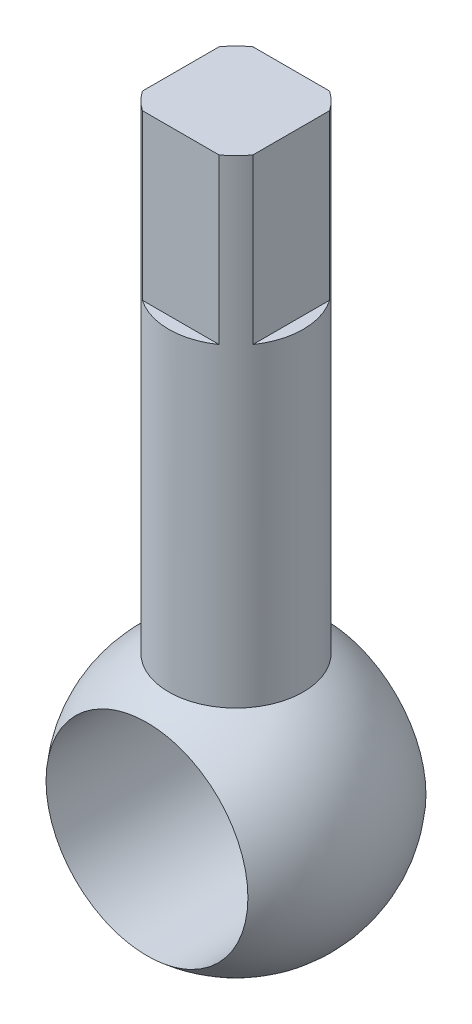
ISO-10303-21;
HEADER;
FILE_DESCRIPTION(('STEP AP214'),'2;1');
FILE_NAME('part.step','',(''),(''),'','','');
FILE_SCHEMA(('AUTOMOTIVE_DESIGN { 1 0 10303 214 1 1 1 1 }'));
ENDSEC;
DATA;
#1=APPLICATION_CONTEXT('core data for automotive mechanical design processes');
#2=APPLICATION_PROTOCOL_DEFINITION('international standard','automotive_design',2000,#1);
#3=PRODUCT_CONTEXT('',#1,'mechanical');
#4=PRODUCT('Part','Part','',(#3));
#5=PRODUCT_RELATED_PRODUCT_CATEGORY('part','',(#4));
#6=PRODUCT_DEFINITION_FORMATION('','',#4);
#7=PRODUCT_DEFINITION_CONTEXT('part definition',#1,'design');
#8=PRODUCT_DEFINITION('design','',#6,#7);
#9=PRODUCT_DEFINITION_SHAPE('','',#8);
#10=(LENGTH_UNIT() NAMED_UNIT(*) SI_UNIT(.MILLI.,.METRE.));
#11=(NAMED_UNIT(*) PLANE_ANGLE_UNIT() SI_UNIT($,.RADIAN.));
#12=(NAMED_UNIT(*) SI_UNIT($,.STERADIAN.) SOLID_ANGLE_UNIT());
#13=UNCERTAINTY_MEASURE_WITH_UNIT(LENGTH_MEASURE(1.E-05),#10,'distance_accuracy_value','');
#14=(GEOMETRIC_REPRESENTATION_CONTEXT(3) GLOBAL_UNCERTAINTY_ASSIGNED_CONTEXT((#13)) GLOBAL_UNIT_ASSIGNED_CONTEXT((#10,
#11,#12)) REPRESENTATION_CONTEXT('',''));
#15=CARTESIAN_POINT('',(0.,0.,0.));
#16=DIRECTION('',(0.,0.,1.));
#17=DIRECTION('',(1.,0.,0.));
#18=AXIS2_PLACEMENT_3D('',#15,#16,#17);
#19=CARTESIAN_POINT('',(0.,25.4,0.));
#20=DIRECTION('',(0.,-1.,0.));
#21=DIRECTION('',(-1.,0.,0.));
#22=AXIS2_PLACEMENT_3D('',#19,#20,#21);
#23=SPHERICAL_SURFACE('',#22,25.4);
#24=CARTESIAN_POINT('',(0.,25.4,16.8005208252601));
#25=DIRECTION('',(0.,0.,-1.));
#26=DIRECTION('',(-1.,0.,0.));
#27=AXIS2_PLACEMENT_3D('',#24,#25,#26);
#28=CIRCLE('',#27,19.05);
#29=CARTESIAN_POINT('',(-19.05,25.4,16.8005208252601));
#30=VERTEX_POINT('',#29);
#31=EDGE_CURVE('E149',#30,#30,#28,.T.);
#32=ORIENTED_EDGE('',*,*,#31,.T.);
#33=EDGE_LOOP('',(#32));
#34=FACE_BOUND('',#33,.T.);
#35=CARTESIAN_POINT('',(0.,25.4,-16.8005208252601));
#36=DIRECTION('',(0.,0.,1.));
#37=DIRECTION('',(1.,0.,0.));
#38=AXIS2_PLACEMENT_3D('',#35,#36,#37);
#39=CIRCLE('',#38,19.05);
#40=CARTESIAN_POINT('',(19.05,25.4,-16.8005208252601));
#41=VERTEX_POINT('',#40);
#42=EDGE_CURVE('E142',#41,#41,#39,.T.);
#43=ORIENTED_EDGE('',*,*,#42,.T.);
#44=EDGE_LOOP('',(#43));
#45=FACE_BOUND('',#44,.T.);
#46=CARTESIAN_POINT('',(0.,47.3970452561247,0.));
#47=DIRECTION('',(0.,-1.,0.));
#48=DIRECTION('',(0.,0.,-1.));
#49=AXIS2_PLACEMENT_3D('',#46,#47,#48);
#50=CIRCLE('',#49,12.7);
#51=CARTESIAN_POINT('',(0.,47.3970452561247,-12.7));
#52=VERTEX_POINT('',#51);
#53=EDGE_CURVE('E145',#52,#52,#50,.T.);
#54=ORIENTED_EDGE('',*,*,#53,.T.);
#55=EDGE_LOOP('',(#54));
#56=FACE_BOUND('',#55,.T.);
#57=ADVANCED_FACE('F36',(#34,#45,#56),#23,.T.);
#58=CARTESIAN_POINT('',(0.,137.668,0.));
#59=DIRECTION('',(0.,-1.,0.));
#60=DIRECTION('',(0.,0.,-1.));
#61=AXIS2_PLACEMENT_3D('',#58,#59,#60);
#62=PLANE('',#61);
#63=CARTESIAN_POINT('',(0.,137.668,0.));
#64=DIRECTION('',(0.,-1.,0.));
#65=DIRECTION('',(0.,0.,-1.));
#66=AXIS2_PLACEMENT_3D('',#63,#64,#65);
#67=CIRCLE('',#66,12.7);
#68=CARTESIAN_POINT('',(10.4348875892364,137.668,7.23900000000004));
#69=VERTEX_POINT('',#68);
#70=CARTESIAN_POINT('',(7.239,137.668,10.4348875892364));
#71=VERTEX_POINT('',#70);
#72=EDGE_CURVE('E152',#69,#71,#67,.T.);
#73=ORIENTED_EDGE('',*,*,#72,.F.);
#74=DIRECTION('',(0.,0.,1.));
#75=VECTOR('',#74,1.);
#76=CARTESIAN_POINT('',(10.4348875892364,137.668,-7.23899999999996));
#77=LINE('',#76,#75);
#78=CARTESIAN_POINT('',(10.4348875892364,137.668,-7.23899999999996));
#79=VERTEX_POINT('',#78);
#80=EDGE_CURVE('E106',#79,#69,#77,.T.);
#81=ORIENTED_EDGE('',*,*,#80,.F.);
#82=CARTESIAN_POINT('',(7.239,137.668,-10.4348875892364));
#83=VERTEX_POINT('',#82);
#84=EDGE_CURVE('E113',#83,#79,#67,.T.);
#85=ORIENTED_EDGE('',*,*,#84,.F.);
#86=DIRECTION('',(1.,0.,0.));
#87=VECTOR('',#86,1.);
#88=CARTESIAN_POINT('',(-7.239,137.668,-10.4348875892364));
#89=LINE('',#88,#87);
#90=CARTESIAN_POINT('',(-7.239,137.668,-10.4348875892364));
#91=VERTEX_POINT('',#90);
#92=EDGE_CURVE('E115',#91,#83,#89,.T.);
#93=ORIENTED_EDGE('',*,*,#92,.F.);
#94=CARTESIAN_POINT('',(-10.4348875892363,137.668,-7.23900000000011));
#95=VERTEX_POINT('',#94);
#96=EDGE_CURVE('E148',#95,#91,#67,.T.);
#97=ORIENTED_EDGE('',*,*,#96,.F.);
#98=DIRECTION('',(0.,0.,-1.));
#99=VECTOR('',#98,1.);
#100=CARTESIAN_POINT('',(-10.4348875892365,137.668,7.23899999999989));
#101=LINE('',#100,#99);
#102=CARTESIAN_POINT('',(-10.4348875892365,137.668,7.23899999999989));
#103=VERTEX_POINT('',#102);
#104=EDGE_CURVE('E131',#103,#95,#101,.T.);
#105=ORIENTED_EDGE('',*,*,#104,.F.);
#106=CARTESIAN_POINT('',(-7.239,137.668,10.4348875892364));
#107=VERTEX_POINT('',#106);
#108=EDGE_CURVE('E174',#107,#103,#67,.T.);
#109=ORIENTED_EDGE('',*,*,#108,.F.);
#110=DIRECTION('',(-1.,0.,0.));
#111=VECTOR('',#110,1.);
#112=CARTESIAN_POINT('',(7.239,137.668,10.4348875892364));
#113=LINE('',#112,#111);
#114=EDGE_CURVE('E121',#71,#107,#113,.T.);
#115=ORIENTED_EDGE('',*,*,#114,.F.);
#116=EDGE_LOOP('',(#73,#81,#85,#93,#97,#105,#109,#115));
#117=FACE_BOUND('',#116,.T.);
#118=ADVANCED_FACE('F172',(#117),#62,.F.);
#119=CARTESIAN_POINT('',(0.,0.,0.));
#120=DIRECTION('',(0.,-1.,0.));
#121=DIRECTION('',(0.,0.,-1.));
#122=AXIS2_PLACEMENT_3D('',#119,#120,#121);
#123=CYLINDRICAL_SURFACE('',#122,12.7);
#124=ORIENTED_EDGE('',*,*,#84,.T.);
#125=DIRECTION('',(0.,1.,0.));
#126=VECTOR('',#125,1.);
#127=CARTESIAN_POINT('',(10.4348875892364,106.68,-7.23899999999996));
#128=LINE('',#127,#126);
#129=CARTESIAN_POINT('',(10.4348875892364,106.68,-7.23899999999996));
#130=VERTEX_POINT('',#129);
#131=EDGE_CURVE('E103',#130,#79,#128,.T.);
#132=ORIENTED_EDGE('',*,*,#131,.F.);
#133=CARTESIAN_POINT('',(0.,106.68,0.));
#134=DIRECTION('',(0.,-1.,0.));
#135=DIRECTION('',(0.,0.,-1.));
#136=AXIS2_PLACEMENT_3D('',#133,#134,#135);
#137=CIRCLE('',#136,12.7);
#138=CARTESIAN_POINT('',(10.4348875892364,106.68,7.23900000000004));
#139=VERTEX_POINT('',#138);
#140=EDGE_CURVE('E11',#130,#139,#137,.T.);
#141=ORIENTED_EDGE('',*,*,#140,.T.);
#142=DIRECTION('',(0.,1.,0.));
#143=VECTOR('',#142,1.);
#144=CARTESIAN_POINT('',(10.4348875892364,106.68,7.23900000000004));
#145=LINE('',#144,#143);
#146=EDGE_CURVE('E105',#139,#69,#145,.T.);
#147=ORIENTED_EDGE('',*,*,#146,.T.);
#148=ORIENTED_EDGE('',*,*,#72,.T.);
#149=DIRECTION('',(0.,1.,0.));
#150=VECTOR('',#149,1.);
#151=CARTESIAN_POINT('',(7.239,106.68,10.4348875892364));
#152=LINE('',#151,#150);
#153=CARTESIAN_POINT('',(7.239,106.68,10.4348875892364));
#154=VERTEX_POINT('',#153);
#155=EDGE_CURVE('E120',#154,#71,#152,.T.);
#156=ORIENTED_EDGE('',*,*,#155,.F.);
#157=CARTESIAN_POINT('',(0.,106.68,0.));
#158=DIRECTION('',(0.,-1.,0.));
#159=DIRECTION('',(0.,0.,-1.));
#160=AXIS2_PLACEMENT_3D('',#157,#158,#159);
#161=CIRCLE('',#160,12.7);
#162=CARTESIAN_POINT('',(-7.239,106.68,10.4348875892364));
#163=VERTEX_POINT('',#162);
#164=EDGE_CURVE('E43',#154,#163,#161,.T.);
#165=ORIENTED_EDGE('',*,*,#164,.T.);
#166=DIRECTION('',(0.,1.,0.));
#167=VECTOR('',#166,1.);
#168=CARTESIAN_POINT('',(-7.239,106.68,10.4348875892364));
#169=LINE('',#168,#167);
#170=EDGE_CURVE('E124',#163,#107,#169,.T.);
#171=ORIENTED_EDGE('',*,*,#170,.T.);
#172=ORIENTED_EDGE('',*,*,#108,.T.);
#173=DIRECTION('',(0.,1.,0.));
#174=VECTOR('',#173,1.);
#175=CARTESIAN_POINT('',(-10.4348875892365,106.68,7.23899999999989));
#176=LINE('',#175,#174);
#177=CARTESIAN_POINT('',(-10.4348875892365,106.68,7.23899999999989));
#178=VERTEX_POINT('',#177);
#179=EDGE_CURVE('E130',#178,#103,#176,.T.);
#180=ORIENTED_EDGE('',*,*,#179,.F.);
#181=CARTESIAN_POINT('',(0.,106.68,0.));
#182=DIRECTION('',(0.,-1.,0.));
#183=DIRECTION('',(0.,0.,-1.));
#184=AXIS2_PLACEMENT_3D('',#181,#182,#183);
#185=CIRCLE('',#184,12.7);
#186=CARTESIAN_POINT('',(-10.4348875892363,106.68,-7.23900000000011));
#187=VERTEX_POINT('',#186);
#188=EDGE_CURVE('E159',#178,#187,#185,.T.);
#189=ORIENTED_EDGE('',*,*,#188,.T.);
#190=DIRECTION('',(0.,1.,0.));
#191=VECTOR('',#190,1.);
#192=CARTESIAN_POINT('',(-10.4348875892363,106.68,-7.23900000000011));
#193=LINE('',#192,#191);
#194=EDGE_CURVE('E123',#187,#95,#193,.T.);
#195=ORIENTED_EDGE('',*,*,#194,.T.);
#196=ORIENTED_EDGE('',*,*,#96,.T.);
#197=DIRECTION('',(0.,1.,0.));
#198=VECTOR('',#197,1.);
#199=CARTESIAN_POINT('',(-7.239,106.68,-10.4348875892364));
#200=LINE('',#199,#198);
#201=CARTESIAN_POINT('',(-7.239,106.68,-10.4348875892364));
#202=VERTEX_POINT('',#201);
#203=EDGE_CURVE('E138',#202,#91,#200,.T.);
#204=ORIENTED_EDGE('',*,*,#203,.F.);
#205=CARTESIAN_POINT('',(0.,106.68,0.));
#206=DIRECTION('',(0.,-1.,0.));
#207=DIRECTION('',(0.,0.,-1.));
#208=AXIS2_PLACEMENT_3D('',#205,#206,#207);
#209=CIRCLE('',#208,12.7);
#210=CARTESIAN_POINT('',(7.239,106.68,-10.4348875892364));
#211=VERTEX_POINT('',#210);
#212=EDGE_CURVE('E151',#202,#211,#209,.T.);
#213=ORIENTED_EDGE('',*,*,#212,.T.);
#214=DIRECTION('',(0.,1.,0.));
#215=VECTOR('',#214,1.);
#216=CARTESIAN_POINT('',(7.239,106.68,-10.4348875892364));
#217=LINE('',#216,#215);
#218=EDGE_CURVE('E140',#211,#83,#217,.T.);
#219=ORIENTED_EDGE('',*,*,#218,.T.);
#220=EDGE_LOOP('',(#124,#132,#141,#147,#148,#156,#165,#171,#172,#180,#189,#195,#196,#204,#213,#219));
#221=FACE_BOUND('',#220,.T.);
#222=ORIENTED_EDGE('',*,*,#53,.F.);
#223=EDGE_LOOP('',(#222));
#224=FACE_BOUND('',#223,.T.);
#225=ADVANCED_FACE('F109',(#221,#224),#123,.T.);
#226=CARTESIAN_POINT('',(0.,25.4,-25.4));
#227=DIRECTION('',(0.,0.,1.));
#228=DIRECTION('',(1.,0.,0.));
#229=AXIS2_PLACEMENT_3D('',#226,#227,#228);
#230=CYLINDRICAL_SURFACE('',#229,19.05);
#231=ORIENTED_EDGE('',*,*,#42,.F.);
#232=EDGE_LOOP('',(#231));
#233=FACE_BOUND('',#232,.T.);
#234=ORIENTED_EDGE('',*,*,#31,.F.);
#235=EDGE_LOOP('',(#234));
#236=FACE_BOUND('',#235,.T.);
#237=ADVANCED_FACE('F187',(#233,#236),#230,.F.);
#238=CARTESIAN_POINT('',(0.,106.68,0.));
#239=DIRECTION('',(0.,-1.,0.));
#240=DIRECTION('',(0.,0.,-1.));
#241=AXIS2_PLACEMENT_3D('',#238,#239,#240);
#242=PLANE('',#241);
#243=DIRECTION('',(1.,0.,0.));
#244=VECTOR('',#243,1.);
#245=CARTESIAN_POINT('',(-7.239,106.68,-10.4348875892364));
#246=LINE('',#245,#244);
#247=EDGE_CURVE('E136',#202,#211,#246,.T.);
#248=ORIENTED_EDGE('',*,*,#247,.T.);
#249=ORIENTED_EDGE('',*,*,#212,.F.);
#250=EDGE_LOOP('',(#248,#249));
#251=FACE_BOUND('',#250,.T.);
#252=ADVANCED_FACE('F185',(#251),#242,.F.);
#253=CARTESIAN_POINT('',(-7.239,106.68,-10.4348875892364));
#254=DIRECTION('',(0.,0.,1.));
#255=DIRECTION('',(1.,0.,0.));
#256=AXIS2_PLACEMENT_3D('',#253,#254,#255);
#257=PLANE('',#256);
#258=ORIENTED_EDGE('',*,*,#92,.T.);
#259=ORIENTED_EDGE('',*,*,#218,.F.);
#260=ORIENTED_EDGE('',*,*,#247,.F.);
#261=ORIENTED_EDGE('',*,*,#203,.T.);
#262=EDGE_LOOP('',(#258,#259,#260,#261));
#263=FACE_BOUND('',#262,.T.);
#264=ADVANCED_FACE('F182',(#263),#257,.F.);
#265=CARTESIAN_POINT('',(0.,106.68,0.));
#266=DIRECTION('',(0.,-1.,0.));
#267=DIRECTION('',(-1.,0.,0.));
#268=AXIS2_PLACEMENT_3D('',#265,#266,#267);
#269=PLANE('',#268);
#270=DIRECTION('',(0.,0.,-1.));
#271=VECTOR('',#270,1.);
#272=CARTESIAN_POINT('',(-10.4348875892365,106.68,7.23899999999989));
#273=LINE('',#272,#271);
#274=EDGE_CURVE('E128',#178,#187,#273,.T.);
#275=ORIENTED_EDGE('',*,*,#274,.T.);
#276=ORIENTED_EDGE('',*,*,#188,.F.);
#277=EDGE_LOOP('',(#275,#276));
#278=FACE_BOUND('',#277,.T.);
#279=ADVANCED_FACE('F193',(#278),#269,.F.);
#280=CARTESIAN_POINT('',(-10.4348875892365,106.68,7.23899999999989));
#281=DIRECTION('',(1.,0.,0.));
#282=DIRECTION('',(0.,0.,-1.));
#283=AXIS2_PLACEMENT_3D('',#280,#281,#282);
#284=PLANE('',#283);
#285=ORIENTED_EDGE('',*,*,#104,.T.);
#286=ORIENTED_EDGE('',*,*,#194,.F.);
#287=ORIENTED_EDGE('',*,*,#274,.F.);
#288=ORIENTED_EDGE('',*,*,#179,.T.);
#289=EDGE_LOOP('',(#285,#286,#287,#288));
#290=FACE_BOUND('',#289,.T.);
#291=ADVANCED_FACE('F247',(#290),#284,.F.);
#292=CARTESIAN_POINT('',(0.,106.68,0.));
#293=DIRECTION('',(0.,-1.,0.));
#294=DIRECTION('',(0.,0.,1.));
#295=AXIS2_PLACEMENT_3D('',#292,#293,#294);
#296=PLANE('',#295);
#297=DIRECTION('',(-1.,0.,0.));
#298=VECTOR('',#297,1.);
#299=CARTESIAN_POINT('',(7.239,106.68,10.4348875892364));
#300=LINE('',#299,#298);
#301=EDGE_CURVE('E56',#154,#163,#300,.T.);
#302=ORIENTED_EDGE('',*,*,#301,.T.);
#303=ORIENTED_EDGE('',*,*,#164,.F.);
#304=EDGE_LOOP('',(#302,#303));
#305=FACE_BOUND('',#304,.T.);
#306=ADVANCED_FACE('F166',(#305),#296,.F.);
#307=CARTESIAN_POINT('',(7.239,106.68,10.4348875892364));
#308=DIRECTION('',(0.,0.,-1.));
#309=DIRECTION('',(-1.,0.,0.));
#310=AXIS2_PLACEMENT_3D('',#307,#308,#309);
#311=PLANE('',#310);
#312=ORIENTED_EDGE('',*,*,#114,.T.);
#313=ORIENTED_EDGE('',*,*,#170,.F.);
#314=ORIENTED_EDGE('',*,*,#301,.F.);
#315=ORIENTED_EDGE('',*,*,#155,.T.);
#316=EDGE_LOOP('',(#312,#313,#314,#315));
#317=FACE_BOUND('',#316,.T.);
#318=ADVANCED_FACE('F168',(#317),#311,.F.);
#319=CARTESIAN_POINT('',(0.,106.68,0.));
#320=DIRECTION('',(0.,-1.,0.));
#321=DIRECTION('',(1.,0.,0.));
#322=AXIS2_PLACEMENT_3D('',#319,#320,#321);
#323=PLANE('',#322);
#324=DIRECTION('',(0.,0.,1.));
#325=VECTOR('',#324,1.);
#326=CARTESIAN_POINT('',(10.4348875892364,106.68,-7.23899999999996));
#327=LINE('',#326,#325);
#328=EDGE_CURVE('E49',#130,#139,#327,.T.);
#329=ORIENTED_EDGE('',*,*,#328,.T.);
#330=ORIENTED_EDGE('',*,*,#140,.F.);
#331=EDGE_LOOP('',(#329,#330));
#332=FACE_BOUND('',#331,.T.);
#333=ADVANCED_FACE('F97',(#332),#323,.F.);
#334=CARTESIAN_POINT('',(10.4348875892364,106.68,-7.23899999999996));
#335=DIRECTION('',(-1.,0.,0.));
#336=DIRECTION('',(0.,0.,1.));
#337=AXIS2_PLACEMENT_3D('',#334,#335,#336);
#338=PLANE('',#337);
#339=ORIENTED_EDGE('',*,*,#80,.T.);
#340=ORIENTED_EDGE('',*,*,#146,.F.);
#341=ORIENTED_EDGE('',*,*,#328,.F.);
#342=ORIENTED_EDGE('',*,*,#131,.T.);
#343=EDGE_LOOP('',(#339,#340,#341,#342));
#344=FACE_BOUND('',#343,.T.);
#345=ADVANCED_FACE('F102',(#344),#338,.F.);
#346=CLOSED_SHELL('',(#57,#118,#225,#237,#252,#264,#279,#291,#306,#318,#333,#345));
#347=MANIFOLD_SOLID_BREP('B2',#346);
#348=ADVANCED_BREP_SHAPE_REPRESENTATION('',(#18,#347),#14);
#349=SHAPE_DEFINITION_REPRESENTATION(#9,#348);
ENDSEC;
END-ISO-10303-21;
